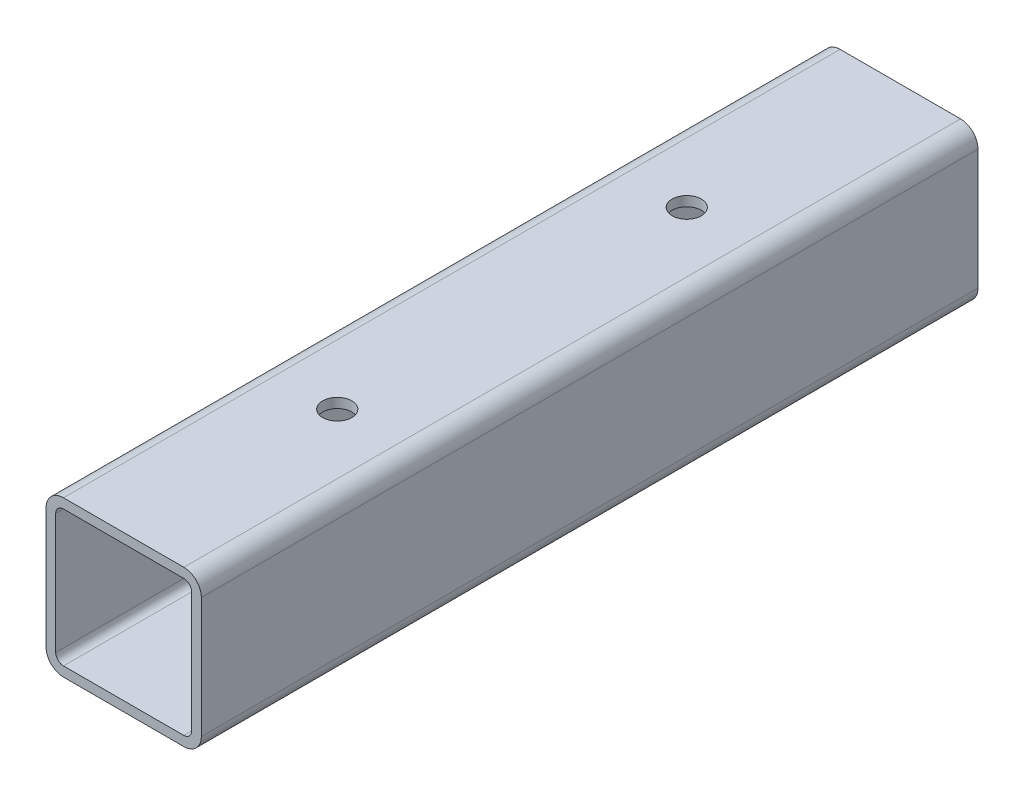
ISO-10303-21;
HEADER;
FILE_DESCRIPTION(('STEP AP214'),'2;1');
FILE_NAME('part.step','',(''),(''),'','','');
FILE_SCHEMA(('AUTOMOTIVE_DESIGN { 1 0 10303 214 1 1 1 1 }'));
ENDSEC;
DATA;
#1=APPLICATION_CONTEXT('core data for automotive mechanical design processes');
#2=APPLICATION_PROTOCOL_DEFINITION('international standard','automotive_design',2000,#1);
#3=PRODUCT_CONTEXT('',#1,'mechanical');
#4=PRODUCT('Part','Part','',(#3));
#5=PRODUCT_RELATED_PRODUCT_CATEGORY('part','',(#4));
#6=PRODUCT_DEFINITION_FORMATION('','',#4);
#7=PRODUCT_DEFINITION_CONTEXT('part definition',#1,'design');
#8=PRODUCT_DEFINITION('design','',#6,#7);
#9=PRODUCT_DEFINITION_SHAPE('','',#8);
#10=(LENGTH_UNIT() NAMED_UNIT(*) SI_UNIT(.MILLI.,.METRE.));
#11=(NAMED_UNIT(*) PLANE_ANGLE_UNIT() SI_UNIT($,.RADIAN.));
#12=(NAMED_UNIT(*) SI_UNIT($,.STERADIAN.) SOLID_ANGLE_UNIT());
#13=UNCERTAINTY_MEASURE_WITH_UNIT(LENGTH_MEASURE(1.E-05),#10,'distance_accuracy_value','');
#14=(GEOMETRIC_REPRESENTATION_CONTEXT(3) GLOBAL_UNCERTAINTY_ASSIGNED_CONTEXT((#13)) GLOBAL_UNIT_ASSIGNED_CONTEXT((#10,
#11,#12)) REPRESENTATION_CONTEXT('',''));
#15=CARTESIAN_POINT('',(0.,0.,0.));
#16=DIRECTION('',(0.,0.,1.));
#17=DIRECTION('',(1.,0.,0.));
#18=AXIS2_PLACEMENT_3D('',#15,#16,#17);
#19=CARTESIAN_POINT('',(-19.685,19.685,127.));
#20=DIRECTION('',(0.,0.,-1.));
#21=DIRECTION('',(-1.,0.,0.));
#22=AXIS2_PLACEMENT_3D('',#19,#20,#21);
#23=PLANE('',#22);
#24=CARTESIAN_POINT('',(-19.685,19.685,127.));
#25=DIRECTION('',(0.,0.,1.));
#26=DIRECTION('',(-1.,0.,0.));
#27=AXIS2_PLACEMENT_3D('',#24,#25,#26);
#28=CIRCLE('',#27,5.715);
#29=CARTESIAN_POINT('',(-19.685,25.4,127.));
#30=VERTEX_POINT('',#29);
#31=CARTESIAN_POINT('',(-25.4,19.685,127.));
#32=VERTEX_POINT('',#31);
#33=EDGE_CURVE('E216',#30,#32,#28,.T.);
#34=ORIENTED_EDGE('',*,*,#33,.T.);
#35=DIRECTION('',(0.,-1.,0.));
#36=VECTOR('',#35,1.);
#37=CARTESIAN_POINT('',(-25.4,-19.685,127.));
#38=LINE('',#37,#36);
#39=CARTESIAN_POINT('',(-25.4,-19.685,127.));
#40=VERTEX_POINT('',#39);
#41=EDGE_CURVE('E219',#32,#40,#38,.T.);
#42=ORIENTED_EDGE('',*,*,#41,.T.);
#43=CARTESIAN_POINT('',(-19.685,-19.685,127.));
#44=DIRECTION('',(0.,0.,1.));
#45=DIRECTION('',(-1.,0.,0.));
#46=AXIS2_PLACEMENT_3D('',#43,#44,#45);
#47=CIRCLE('',#46,5.715);
#48=CARTESIAN_POINT('',(-19.685,-25.4,127.));
#49=VERTEX_POINT('',#48);
#50=EDGE_CURVE('E222',#40,#49,#47,.T.);
#51=ORIENTED_EDGE('',*,*,#50,.T.);
#52=DIRECTION('',(1.,0.,0.));
#53=VECTOR('',#52,1.);
#54=CARTESIAN_POINT('',(-19.685,-25.4,127.));
#55=LINE('',#54,#53);
#56=CARTESIAN_POINT('',(19.685,-25.4,127.));
#57=VERTEX_POINT('',#56);
#58=EDGE_CURVE('E224',#49,#57,#55,.T.);
#59=ORIENTED_EDGE('',*,*,#58,.T.);
#60=CARTESIAN_POINT('',(19.685,-19.685,127.));
#61=DIRECTION('',(0.,0.,1.));
#62=DIRECTION('',(1.,0.,0.));
#63=AXIS2_PLACEMENT_3D('',#60,#61,#62);
#64=CIRCLE('',#63,5.715);
#65=CARTESIAN_POINT('',(25.4,-19.685,127.));
#66=VERTEX_POINT('',#65);
#67=EDGE_CURVE('E226',#57,#66,#64,.T.);
#68=ORIENTED_EDGE('',*,*,#67,.T.);
#69=DIRECTION('',(0.,1.,0.));
#70=VECTOR('',#69,1.);
#71=CARTESIAN_POINT('',(25.4,-19.685,127.));
#72=LINE('',#71,#70);
#73=CARTESIAN_POINT('',(25.4,19.685,127.));
#74=VERTEX_POINT('',#73);
#75=EDGE_CURVE('E228',#66,#74,#72,.T.);
#76=ORIENTED_EDGE('',*,*,#75,.T.);
#77=CARTESIAN_POINT('',(19.685,19.685,127.));
#78=DIRECTION('',(0.,0.,1.));
#79=DIRECTION('',(-1.,0.,0.));
#80=AXIS2_PLACEMENT_3D('',#77,#78,#79);
#81=CIRCLE('',#80,5.715);
#82=CARTESIAN_POINT('',(19.685,25.4,127.));
#83=VERTEX_POINT('',#82);
#84=EDGE_CURVE('E230',#74,#83,#81,.T.);
#85=ORIENTED_EDGE('',*,*,#84,.T.);
#86=DIRECTION('',(-1.,0.,0.));
#87=VECTOR('',#86,1.);
#88=CARTESIAN_POINT('',(-19.685,25.4,127.));
#89=LINE('',#88,#87);
#90=EDGE_CURVE('E232',#83,#30,#89,.T.);
#91=ORIENTED_EDGE('',*,*,#90,.T.);
#92=EDGE_LOOP('',(#34,#42,#51,#59,#68,#76,#85,#91));
#93=FACE_BOUND('',#92,.T.);
#94=CARTESIAN_POINT('',(-19.685,-19.685,127.));
#95=DIRECTION('',(0.,0.,1.));
#96=DIRECTION('',(-1.,0.,0.));
#97=AXIS2_PLACEMENT_3D('',#94,#95,#96);
#98=CIRCLE('',#97,2.54);
#99=CARTESIAN_POINT('',(-22.2249999999999,-19.685,127.));
#100=VERTEX_POINT('',#99);
#101=CARTESIAN_POINT('',(-19.685,-22.225,127.));
#102=VERTEX_POINT('',#101);
#103=EDGE_CURVE('E149',#100,#102,#98,.T.);
#104=ORIENTED_EDGE('',*,*,#103,.F.);
#105=DIRECTION('',(0.,-1.,0.));
#106=VECTOR('',#105,1.);
#107=CARTESIAN_POINT('',(-22.2249999999999,-19.685,127.));
#108=LINE('',#107,#106);
#109=CARTESIAN_POINT('',(-22.2249999999999,19.685,127.));
#110=VERTEX_POINT('',#109);
#111=EDGE_CURVE('E183',#110,#100,#108,.T.);
#112=ORIENTED_EDGE('',*,*,#111,.F.);
#113=CARTESIAN_POINT('',(-19.685,19.685,127.));
#114=DIRECTION('',(0.,0.,1.));
#115=DIRECTION('',(-1.,0.,0.));
#116=AXIS2_PLACEMENT_3D('',#113,#114,#115);
#117=CIRCLE('',#116,2.54);
#118=CARTESIAN_POINT('',(-19.685,22.225,127.));
#119=VERTEX_POINT('',#118);
#120=EDGE_CURVE('E181',#119,#110,#117,.T.);
#121=ORIENTED_EDGE('',*,*,#120,.F.);
#122=DIRECTION('',(-1.,0.,0.));
#123=VECTOR('',#122,1.);
#124=CARTESIAN_POINT('',(-19.685,22.225,127.));
#125=LINE('',#124,#123);
#126=CARTESIAN_POINT('',(19.685,22.225,127.));
#127=VERTEX_POINT('',#126);
#128=EDGE_CURVE('E179',#127,#119,#125,.T.);
#129=ORIENTED_EDGE('',*,*,#128,.F.);
#130=CARTESIAN_POINT('',(19.685,19.685,127.));
#131=DIRECTION('',(0.,0.,1.));
#132=DIRECTION('',(-1.,0.,0.));
#133=AXIS2_PLACEMENT_3D('',#130,#131,#132);
#134=CIRCLE('',#133,2.54);
#135=CARTESIAN_POINT('',(22.2249999999999,19.685,127.));
#136=VERTEX_POINT('',#135);
#137=EDGE_CURVE('E177',#136,#127,#134,.T.);
#138=ORIENTED_EDGE('',*,*,#137,.F.);
#139=DIRECTION('',(0.,1.,0.));
#140=VECTOR('',#139,1.);
#141=CARTESIAN_POINT('',(22.2249999999999,-19.685,127.));
#142=LINE('',#141,#140);
#143=CARTESIAN_POINT('',(22.2249999999999,-19.685,127.));
#144=VERTEX_POINT('',#143);
#145=EDGE_CURVE('E172',#144,#136,#142,.T.);
#146=ORIENTED_EDGE('',*,*,#145,.F.);
#147=CARTESIAN_POINT('',(19.685,-19.685,127.));
#148=DIRECTION('',(0.,0.,1.));
#149=DIRECTION('',(1.,0.,0.));
#150=AXIS2_PLACEMENT_3D('',#147,#148,#149);
#151=CIRCLE('',#150,2.54);
#152=CARTESIAN_POINT('',(19.685,-22.225,127.));
#153=VERTEX_POINT('',#152);
#154=EDGE_CURVE('E170',#153,#144,#151,.T.);
#155=ORIENTED_EDGE('',*,*,#154,.F.);
#156=DIRECTION('',(1.,0.,0.));
#157=VECTOR('',#156,1.);
#158=CARTESIAN_POINT('',(-19.685,-22.225,127.));
#159=LINE('',#158,#157);
#160=EDGE_CURVE('E157',#102,#153,#159,.T.);
#161=ORIENTED_EDGE('',*,*,#160,.F.);
#162=EDGE_LOOP('',(#104,#112,#121,#129,#138,#146,#155,#161));
#163=FACE_BOUND('',#162,.T.);
#164=ADVANCED_FACE('F34',(#93,#163),#23,.F.);
#165=CARTESIAN_POINT('',(-19.685,19.685,-127.));
#166=DIRECTION('',(0.,0.,-1.));
#167=DIRECTION('',(-1.,0.,0.));
#168=AXIS2_PLACEMENT_3D('',#165,#166,#167);
#169=PLANE('',#168);
#170=CARTESIAN_POINT('',(-19.685,19.685,-127.));
#171=DIRECTION('',(0.,0.,1.));
#172=DIRECTION('',(-1.,0.,0.));
#173=AXIS2_PLACEMENT_3D('',#170,#171,#172);
#174=CIRCLE('',#173,5.715);
#175=CARTESIAN_POINT('',(-19.685,25.4,-127.));
#176=VERTEX_POINT('',#175);
#177=CARTESIAN_POINT('',(-25.4,19.685,-127.));
#178=VERTEX_POINT('',#177);
#179=EDGE_CURVE('E165',#176,#178,#174,.T.);
#180=ORIENTED_EDGE('',*,*,#179,.F.);
#181=DIRECTION('',(-1.,0.,0.));
#182=VECTOR('',#181,1.);
#183=CARTESIAN_POINT('',(-19.685,25.4,-127.));
#184=LINE('',#183,#182);
#185=CARTESIAN_POINT('',(19.685,25.4,-127.));
#186=VERTEX_POINT('',#185);
#187=EDGE_CURVE('E220',#186,#176,#184,.T.);
#188=ORIENTED_EDGE('',*,*,#187,.F.);
#189=CARTESIAN_POINT('',(19.685,19.685,-127.));
#190=DIRECTION('',(0.,0.,1.));
#191=DIRECTION('',(-1.,0.,0.));
#192=AXIS2_PLACEMENT_3D('',#189,#190,#191);
#193=CIRCLE('',#192,5.715);
#194=CARTESIAN_POINT('',(25.4,19.685,-127.));
#195=VERTEX_POINT('',#194);
#196=EDGE_CURVE('E247',#195,#186,#193,.T.);
#197=ORIENTED_EDGE('',*,*,#196,.F.);
#198=DIRECTION('',(0.,1.,0.));
#199=VECTOR('',#198,1.);
#200=CARTESIAN_POINT('',(25.4,-19.685,-127.));
#201=LINE('',#200,#199);
#202=CARTESIAN_POINT('',(25.4,-19.685,-127.));
#203=VERTEX_POINT('',#202);
#204=EDGE_CURVE('E245',#203,#195,#201,.T.);
#205=ORIENTED_EDGE('',*,*,#204,.F.);
#206=CARTESIAN_POINT('',(19.685,-19.685,-127.));
#207=DIRECTION('',(0.,0.,1.));
#208=DIRECTION('',(1.,0.,0.));
#209=AXIS2_PLACEMENT_3D('',#206,#207,#208);
#210=CIRCLE('',#209,5.715);
#211=CARTESIAN_POINT('',(19.685,-25.4,-127.));
#212=VERTEX_POINT('',#211);
#213=EDGE_CURVE('E243',#212,#203,#210,.T.);
#214=ORIENTED_EDGE('',*,*,#213,.F.);
#215=DIRECTION('',(1.,0.,0.));
#216=VECTOR('',#215,1.);
#217=CARTESIAN_POINT('',(-19.685,-25.4,-127.));
#218=LINE('',#217,#216);
#219=CARTESIAN_POINT('',(-19.685,-25.4,-127.));
#220=VERTEX_POINT('',#219);
#221=EDGE_CURVE('E241',#220,#212,#218,.T.);
#222=ORIENTED_EDGE('',*,*,#221,.F.);
#223=CARTESIAN_POINT('',(-19.685,-19.685,-127.));
#224=DIRECTION('',(0.,0.,1.));
#225=DIRECTION('',(-1.,0.,0.));
#226=AXIS2_PLACEMENT_3D('',#223,#224,#225);
#227=CIRCLE('',#226,5.715);
#228=CARTESIAN_POINT('',(-25.4,-19.685,-127.));
#229=VERTEX_POINT('',#228);
#230=EDGE_CURVE('E239',#229,#220,#227,.T.);
#231=ORIENTED_EDGE('',*,*,#230,.F.);
#232=DIRECTION('',(0.,-1.,0.));
#233=VECTOR('',#232,1.);
#234=CARTESIAN_POINT('',(-25.4,-19.685,-127.));
#235=LINE('',#234,#233);
#236=EDGE_CURVE('E237',#178,#229,#235,.T.);
#237=ORIENTED_EDGE('',*,*,#236,.F.);
#238=EDGE_LOOP('',(#180,#188,#197,#205,#214,#222,#231,#237));
#239=FACE_BOUND('',#238,.T.);
#240=DIRECTION('',(0.,-1.,0.));
#241=VECTOR('',#240,1.);
#242=CARTESIAN_POINT('',(-22.2249999999999,-19.685,-127.));
#243=LINE('',#242,#241);
#244=CARTESIAN_POINT('',(-22.2249999999999,19.685,-127.));
#245=VERTEX_POINT('',#244);
#246=CARTESIAN_POINT('',(-22.2249999999999,-19.685,-127.));
#247=VERTEX_POINT('',#246);
#248=EDGE_CURVE('E158',#245,#247,#243,.T.);
#249=ORIENTED_EDGE('',*,*,#248,.T.);
#250=CARTESIAN_POINT('',(-19.685,-19.685,-127.));
#251=DIRECTION('',(0.,0.,1.));
#252=DIRECTION('',(-1.,0.,0.));
#253=AXIS2_PLACEMENT_3D('',#250,#251,#252);
#254=CIRCLE('',#253,2.54);
#255=CARTESIAN_POINT('',(-19.685,-22.225,-127.));
#256=VERTEX_POINT('',#255);
#257=EDGE_CURVE('E59',#247,#256,#254,.T.);
#258=ORIENTED_EDGE('',*,*,#257,.T.);
#259=DIRECTION('',(1.,0.,0.));
#260=VECTOR('',#259,1.);
#261=CARTESIAN_POINT('',(-19.685,-22.225,-127.));
#262=LINE('',#261,#260);
#263=CARTESIAN_POINT('',(19.685,-22.225,-127.));
#264=VERTEX_POINT('',#263);
#265=EDGE_CURVE('E164',#256,#264,#262,.T.);
#266=ORIENTED_EDGE('',*,*,#265,.T.);
#267=CARTESIAN_POINT('',(19.685,-19.685,-127.));
#268=DIRECTION('',(0.,0.,1.));
#269=DIRECTION('',(1.,0.,0.));
#270=AXIS2_PLACEMENT_3D('',#267,#268,#269);
#271=CIRCLE('',#270,2.54);
#272=CARTESIAN_POINT('',(22.2249999999999,-19.685,-127.));
#273=VERTEX_POINT('',#272);
#274=EDGE_CURVE('E188',#264,#273,#271,.T.);
#275=ORIENTED_EDGE('',*,*,#274,.T.);
#276=DIRECTION('',(0.,1.,0.));
#277=VECTOR('',#276,1.);
#278=CARTESIAN_POINT('',(22.2249999999999,-19.685,-127.));
#279=LINE('',#278,#277);
#280=CARTESIAN_POINT('',(22.2249999999999,19.685,-127.));
#281=VERTEX_POINT('',#280);
#282=EDGE_CURVE('E191',#273,#281,#279,.T.);
#283=ORIENTED_EDGE('',*,*,#282,.T.);
#284=CARTESIAN_POINT('',(19.685,19.685,-127.));
#285=DIRECTION('',(0.,0.,1.));
#286=DIRECTION('',(-1.,0.,0.));
#287=AXIS2_PLACEMENT_3D('',#284,#285,#286);
#288=CIRCLE('',#287,2.54);
#289=CARTESIAN_POINT('',(19.685,22.225,-127.));
#290=VERTEX_POINT('',#289);
#291=EDGE_CURVE('E194',#281,#290,#288,.T.);
#292=ORIENTED_EDGE('',*,*,#291,.T.);
#293=DIRECTION('',(-1.,0.,0.));
#294=VECTOR('',#293,1.);
#295=CARTESIAN_POINT('',(-19.685,22.225,-127.));
#296=LINE('',#295,#294);
#297=CARTESIAN_POINT('',(-19.685,22.225,-127.));
#298=VERTEX_POINT('',#297);
#299=EDGE_CURVE('E197',#290,#298,#296,.T.);
#300=ORIENTED_EDGE('',*,*,#299,.T.);
#301=CARTESIAN_POINT('',(-19.685,19.685,-127.));
#302=DIRECTION('',(0.,0.,1.));
#303=DIRECTION('',(-1.,0.,0.));
#304=AXIS2_PLACEMENT_3D('',#301,#302,#303);
#305=CIRCLE('',#304,2.54);
#306=EDGE_CURVE('E200',#298,#245,#305,.T.);
#307=ORIENTED_EDGE('',*,*,#306,.T.);
#308=EDGE_LOOP('',(#249,#258,#266,#275,#283,#292,#300,#307));
#309=FACE_BOUND('',#308,.T.);
#310=ADVANCED_FACE('F309',(#239,#309),#169,.T.);
#311=CARTESIAN_POINT('',(-19.685,19.685,127.));
#312=DIRECTION('',(0.,0.,-1.));
#313=DIRECTION('',(-1.,0.,0.));
#314=AXIS2_PLACEMENT_3D('',#311,#312,#313);
#315=CYLINDRICAL_SURFACE('',#314,5.715);
#316=ORIENTED_EDGE('',*,*,#179,.T.);
#317=DIRECTION('',(0.,0.,-1.));
#318=VECTOR('',#317,1.);
#319=CARTESIAN_POINT('',(-25.4,19.685,127.));
#320=LINE('',#319,#318);
#321=EDGE_CURVE('E11',#32,#178,#320,.T.);
#322=ORIENTED_EDGE('',*,*,#321,.F.);
#323=ORIENTED_EDGE('',*,*,#33,.F.);
#324=DIRECTION('',(0.,0.,-1.));
#325=VECTOR('',#324,1.);
#326=CARTESIAN_POINT('',(-19.685,25.4,127.));
#327=LINE('',#326,#325);
#328=EDGE_CURVE('E234',#30,#176,#327,.T.);
#329=ORIENTED_EDGE('',*,*,#328,.T.);
#330=EDGE_LOOP('',(#316,#322,#323,#329));
#331=FACE_BOUND('',#330,.T.);
#332=ADVANCED_FACE('F36',(#331),#315,.T.);
#333=CARTESIAN_POINT('',(-25.4,-19.685,127.));
#334=DIRECTION('',(1.,0.,0.));
#335=DIRECTION('',(0.,1.,0.));
#336=AXIS2_PLACEMENT_3D('',#333,#334,#335);
#337=PLANE('',#336);
#338=ORIENTED_EDGE('',*,*,#236,.T.);
#339=DIRECTION('',(0.,0.,-1.));
#340=VECTOR('',#339,1.);
#341=CARTESIAN_POINT('',(-25.4,-19.685,127.));
#342=LINE('',#341,#340);
#343=EDGE_CURVE('E43',#40,#229,#342,.T.);
#344=ORIENTED_EDGE('',*,*,#343,.F.);
#345=ORIENTED_EDGE('',*,*,#41,.F.);
#346=ORIENTED_EDGE('',*,*,#321,.T.);
#347=EDGE_LOOP('',(#338,#344,#345,#346));
#348=FACE_BOUND('',#347,.T.);
#349=ADVANCED_FACE('F340',(#348),#337,.F.);
#350=CARTESIAN_POINT('',(-19.685,-19.685,127.));
#351=DIRECTION('',(0.,0.,-1.));
#352=DIRECTION('',(-1.,0.,0.));
#353=AXIS2_PLACEMENT_3D('',#350,#351,#352);
#354=CYLINDRICAL_SURFACE('',#353,5.715);
#355=ORIENTED_EDGE('',*,*,#230,.T.);
#356=DIRECTION('',(0.,0.,-1.));
#357=VECTOR('',#356,1.);
#358=CARTESIAN_POINT('',(-19.685,-25.4,127.));
#359=LINE('',#358,#357);
#360=EDGE_CURVE('E264',#49,#220,#359,.T.);
#361=ORIENTED_EDGE('',*,*,#360,.F.);
#362=ORIENTED_EDGE('',*,*,#50,.F.);
#363=ORIENTED_EDGE('',*,*,#343,.T.);
#364=EDGE_LOOP('',(#355,#361,#362,#363));
#365=FACE_BOUND('',#364,.T.);
#366=ADVANCED_FACE('F338',(#365),#354,.T.);
#367=CARTESIAN_POINT('',(-19.685,-25.4,127.));
#368=DIRECTION('',(0.,1.,0.));
#369=DIRECTION('',(-1.,0.,0.));
#370=AXIS2_PLACEMENT_3D('',#367,#368,#369);
#371=PLANE('',#370);
#372=CARTESIAN_POINT('',(0.,-25.4,-57.15));
#373=DIRECTION('',(0.,1.,0.));
#374=DIRECTION('',(-1.,0.,0.));
#375=AXIS2_PLACEMENT_3D('',#372,#373,#374);
#376=CIRCLE('',#375,4.7625);
#377=CARTESIAN_POINT('',(0.,-25.4,-52.3875));
#378=VERTEX_POINT('',#377);
#379=EDGE_CURVE('E186',#378,#378,#376,.T.);
#380=ORIENTED_EDGE('',*,*,#379,.T.);
#381=EDGE_LOOP('',(#380));
#382=FACE_BOUND('',#381,.T.);
#383=CARTESIAN_POINT('',(0.,-25.4,57.15));
#384=DIRECTION('',(0.,1.,0.));
#385=DIRECTION('',(-1.,0.,0.));
#386=AXIS2_PLACEMENT_3D('',#383,#384,#385);
#387=CIRCLE('',#386,4.7625);
#388=CARTESIAN_POINT('',(0.,-25.4,61.9125));
#389=VERTEX_POINT('',#388);
#390=EDGE_CURVE('E279',#389,#389,#387,.T.);
#391=ORIENTED_EDGE('',*,*,#390,.T.);
#392=EDGE_LOOP('',(#391));
#393=FACE_BOUND('',#392,.T.);
#394=ORIENTED_EDGE('',*,*,#221,.T.);
#395=DIRECTION('',(0.,0.,-1.));
#396=VECTOR('',#395,1.);
#397=CARTESIAN_POINT('',(19.685,-25.4,127.));
#398=LINE('',#397,#396);
#399=EDGE_CURVE('E261',#57,#212,#398,.T.);
#400=ORIENTED_EDGE('',*,*,#399,.F.);
#401=ORIENTED_EDGE('',*,*,#58,.F.);
#402=ORIENTED_EDGE('',*,*,#360,.T.);
#403=EDGE_LOOP('',(#394,#400,#401,#402));
#404=FACE_BOUND('',#403,.T.);
#405=ADVANCED_FACE('F292',(#382,#393,#404),#371,.F.);
#406=CARTESIAN_POINT('',(19.685,-19.685,127.));
#407=DIRECTION('',(0.,0.,-1.));
#408=DIRECTION('',(-1.,0.,0.));
#409=AXIS2_PLACEMENT_3D('',#406,#407,#408);
#410=CYLINDRICAL_SURFACE('',#409,5.715);
#411=ORIENTED_EDGE('',*,*,#213,.T.);
#412=DIRECTION('',(0.,0.,-1.));
#413=VECTOR('',#412,1.);
#414=CARTESIAN_POINT('',(25.4,-19.685,127.));
#415=LINE('',#414,#413);
#416=EDGE_CURVE('E258',#66,#203,#415,.T.);
#417=ORIENTED_EDGE('',*,*,#416,.F.);
#418=ORIENTED_EDGE('',*,*,#67,.F.);
#419=ORIENTED_EDGE('',*,*,#399,.T.);
#420=EDGE_LOOP('',(#411,#417,#418,#419));
#421=FACE_BOUND('',#420,.T.);
#422=ADVANCED_FACE('F331',(#421),#410,.T.);
#423=CARTESIAN_POINT('',(25.4,-19.685,127.));
#424=DIRECTION('',(-1.,0.,0.));
#425=DIRECTION('',(0.,-1.,0.));
#426=AXIS2_PLACEMENT_3D('',#423,#424,#425);
#427=PLANE('',#426);
#428=ORIENTED_EDGE('',*,*,#204,.T.);
#429=DIRECTION('',(0.,0.,-1.));
#430=VECTOR('',#429,1.);
#431=CARTESIAN_POINT('',(25.4,19.685,127.));
#432=LINE('',#431,#430);
#433=EDGE_CURVE('E255',#74,#195,#432,.T.);
#434=ORIENTED_EDGE('',*,*,#433,.F.);
#435=ORIENTED_EDGE('',*,*,#75,.F.);
#436=ORIENTED_EDGE('',*,*,#416,.T.);
#437=EDGE_LOOP('',(#428,#434,#435,#436));
#438=FACE_BOUND('',#437,.T.);
#439=ADVANCED_FACE('F327',(#438),#427,.F.);
#440=CARTESIAN_POINT('',(19.685,19.685,127.));
#441=DIRECTION('',(0.,0.,-1.));
#442=DIRECTION('',(-1.,0.,0.));
#443=AXIS2_PLACEMENT_3D('',#440,#441,#442);
#444=CYLINDRICAL_SURFACE('',#443,5.715);
#445=ORIENTED_EDGE('',*,*,#196,.T.);
#446=DIRECTION('',(0.,0.,-1.));
#447=VECTOR('',#446,1.);
#448=CARTESIAN_POINT('',(19.685,25.4,127.));
#449=LINE('',#448,#447);
#450=EDGE_CURVE('E252',#83,#186,#449,.T.);
#451=ORIENTED_EDGE('',*,*,#450,.F.);
#452=ORIENTED_EDGE('',*,*,#84,.F.);
#453=ORIENTED_EDGE('',*,*,#433,.T.);
#454=EDGE_LOOP('',(#445,#451,#452,#453));
#455=FACE_BOUND('',#454,.T.);
#456=ADVANCED_FACE('F323',(#455),#444,.T.);
#457=CARTESIAN_POINT('',(-19.685,25.4,127.));
#458=DIRECTION('',(0.,-1.,0.));
#459=DIRECTION('',(0.,0.,-1.));
#460=AXIS2_PLACEMENT_3D('',#457,#458,#459);
#461=PLANE('',#460);
#462=CARTESIAN_POINT('',(0.,25.4,-57.15));
#463=DIRECTION('',(0.,-1.,0.));
#464=DIRECTION('',(0.,0.,-1.));
#465=AXIS2_PLACEMENT_3D('',#462,#463,#464);
#466=CIRCLE('',#465,4.7625);
#467=CARTESIAN_POINT('',(0.,25.4,-52.3875));
#468=VERTEX_POINT('',#467);
#469=EDGE_CURVE('E287',#468,#468,#466,.T.);
#470=ORIENTED_EDGE('',*,*,#469,.T.);
#471=EDGE_LOOP('',(#470));
#472=FACE_BOUND('',#471,.T.);
#473=CARTESIAN_POINT('',(0.,25.4,57.15));
#474=DIRECTION('',(0.,-1.,0.));
#475=DIRECTION('',(0.,0.,-1.));
#476=AXIS2_PLACEMENT_3D('',#473,#474,#475);
#477=CIRCLE('',#476,4.7625);
#478=CARTESIAN_POINT('',(0.,25.4,61.9125));
#479=VERTEX_POINT('',#478);
#480=EDGE_CURVE('E274',#479,#479,#477,.T.);
#481=ORIENTED_EDGE('',*,*,#480,.T.);
#482=EDGE_LOOP('',(#481));
#483=FACE_BOUND('',#482,.T.);
#484=ORIENTED_EDGE('',*,*,#187,.T.);
#485=ORIENTED_EDGE('',*,*,#328,.F.);
#486=ORIENTED_EDGE('',*,*,#90,.F.);
#487=ORIENTED_EDGE('',*,*,#450,.T.);
#488=EDGE_LOOP('',(#484,#485,#486,#487));
#489=FACE_BOUND('',#488,.T.);
#490=ADVANCED_FACE('F320',(#472,#483,#489),#461,.F.);
#491=CARTESIAN_POINT('',(-19.685,-19.685,127.));
#492=DIRECTION('',(0.,0.,-1.));
#493=DIRECTION('',(-1.,0.,0.));
#494=AXIS2_PLACEMENT_3D('',#491,#492,#493);
#495=CYLINDRICAL_SURFACE('',#494,2.54);
#496=ORIENTED_EDGE('',*,*,#257,.F.);
#497=DIRECTION('',(0.,0.,-1.));
#498=VECTOR('',#497,1.);
#499=CARTESIAN_POINT('',(-22.2249999999999,-19.685,127.));
#500=LINE('',#499,#498);
#501=EDGE_CURVE('E153',#100,#247,#500,.T.);
#502=ORIENTED_EDGE('',*,*,#501,.F.);
#503=ORIENTED_EDGE('',*,*,#103,.T.);
#504=DIRECTION('',(0.,0.,-1.));
#505=VECTOR('',#504,1.);
#506=CARTESIAN_POINT('',(-19.685,-22.225,127.));
#507=LINE('',#506,#505);
#508=EDGE_CURVE('E152',#102,#256,#507,.T.);
#509=ORIENTED_EDGE('',*,*,#508,.T.);
#510=EDGE_LOOP('',(#496,#502,#503,#509));
#511=FACE_BOUND('',#510,.T.);
#512=ADVANCED_FACE('F151',(#511),#495,.F.);
#513=CARTESIAN_POINT('',(-19.685,-22.225,127.));
#514=DIRECTION('',(0.,1.,0.));
#515=DIRECTION('',(0.,0.,1.));
#516=AXIS2_PLACEMENT_3D('',#513,#514,#515);
#517=PLANE('',#516);
#518=CARTESIAN_POINT('',(0.,-22.225,-57.15));
#519=DIRECTION('',(0.,1.,0.));
#520=DIRECTION('',(0.,0.,1.));
#521=AXIS2_PLACEMENT_3D('',#518,#519,#520);
#522=CIRCLE('',#521,4.7625);
#523=CARTESIAN_POINT('',(0.,-22.225,-52.3875));
#524=VERTEX_POINT('',#523);
#525=EDGE_CURVE('E284',#524,#524,#522,.T.);
#526=ORIENTED_EDGE('',*,*,#525,.F.);
#527=EDGE_LOOP('',(#526));
#528=FACE_BOUND('',#527,.T.);
#529=CARTESIAN_POINT('',(0.,-22.225,57.15));
#530=DIRECTION('',(0.,1.,0.));
#531=DIRECTION('',(0.,0.,1.));
#532=AXIS2_PLACEMENT_3D('',#529,#530,#531);
#533=CIRCLE('',#532,4.7625);
#534=CARTESIAN_POINT('',(0.,-22.225,61.9125));
#535=VERTEX_POINT('',#534);
#536=EDGE_CURVE('E270',#535,#535,#533,.T.);
#537=ORIENTED_EDGE('',*,*,#536,.F.);
#538=EDGE_LOOP('',(#537));
#539=FACE_BOUND('',#538,.T.);
#540=ORIENTED_EDGE('',*,*,#265,.F.);
#541=ORIENTED_EDGE('',*,*,#508,.F.);
#542=ORIENTED_EDGE('',*,*,#160,.T.);
#543=DIRECTION('',(0.,0.,-1.));
#544=VECTOR('',#543,1.);
#545=CARTESIAN_POINT('',(19.685,-22.225,127.));
#546=LINE('',#545,#544);
#547=EDGE_CURVE('E166',#153,#264,#546,.T.);
#548=ORIENTED_EDGE('',*,*,#547,.T.);
#549=EDGE_LOOP('',(#540,#541,#542,#548));
#550=FACE_BOUND('',#549,.T.);
#551=ADVANCED_FACE('F161',(#528,#539,#550),#517,.T.);
#552=CARTESIAN_POINT('',(19.685,-19.685,127.));
#553=DIRECTION('',(0.,0.,-1.));
#554=DIRECTION('',(-1.,0.,0.));
#555=AXIS2_PLACEMENT_3D('',#552,#553,#554);
#556=CYLINDRICAL_SURFACE('',#555,2.54);
#557=ORIENTED_EDGE('',*,*,#274,.F.);
#558=ORIENTED_EDGE('',*,*,#547,.F.);
#559=ORIENTED_EDGE('',*,*,#154,.T.);
#560=DIRECTION('',(0.,0.,-1.));
#561=VECTOR('',#560,1.);
#562=CARTESIAN_POINT('',(22.2249999999999,-19.685,127.));
#563=LINE('',#562,#561);
#564=EDGE_CURVE('E213',#144,#273,#563,.T.);
#565=ORIENTED_EDGE('',*,*,#564,.T.);
#566=EDGE_LOOP('',(#557,#558,#559,#565));
#567=FACE_BOUND('',#566,.T.);
#568=ADVANCED_FACE('F395',(#567),#556,.F.);
#569=CARTESIAN_POINT('',(22.2249999999999,-19.685,127.));
#570=DIRECTION('',(-1.,0.,0.));
#571=DIRECTION('',(0.,0.,1.));
#572=AXIS2_PLACEMENT_3D('',#569,#570,#571);
#573=PLANE('',#572);
#574=ORIENTED_EDGE('',*,*,#282,.F.);
#575=ORIENTED_EDGE('',*,*,#564,.F.);
#576=ORIENTED_EDGE('',*,*,#145,.T.);
#577=DIRECTION('',(0.,0.,-1.));
#578=VECTOR('',#577,1.);
#579=CARTESIAN_POINT('',(22.2249999999999,19.685,127.));
#580=LINE('',#579,#578);
#581=EDGE_CURVE('E211',#136,#281,#580,.T.);
#582=ORIENTED_EDGE('',*,*,#581,.T.);
#583=EDGE_LOOP('',(#574,#575,#576,#582));
#584=FACE_BOUND('',#583,.T.);
#585=ADVANCED_FACE('F392',(#584),#573,.T.);
#586=CARTESIAN_POINT('',(19.685,19.685,127.));
#587=DIRECTION('',(0.,0.,-1.));
#588=DIRECTION('',(-1.,0.,0.));
#589=AXIS2_PLACEMENT_3D('',#586,#587,#588);
#590=CYLINDRICAL_SURFACE('',#589,2.54);
#591=ORIENTED_EDGE('',*,*,#291,.F.);
#592=ORIENTED_EDGE('',*,*,#581,.F.);
#593=ORIENTED_EDGE('',*,*,#137,.T.);
#594=DIRECTION('',(0.,0.,-1.));
#595=VECTOR('',#594,1.);
#596=CARTESIAN_POINT('',(19.685,22.225,127.));
#597=LINE('',#596,#595);
#598=EDGE_CURVE('E209',#127,#290,#597,.T.);
#599=ORIENTED_EDGE('',*,*,#598,.T.);
#600=EDGE_LOOP('',(#591,#592,#593,#599));
#601=FACE_BOUND('',#600,.T.);
#602=ADVANCED_FACE('F387',(#601),#590,.F.);
#603=CARTESIAN_POINT('',(-19.685,22.225,127.));
#604=DIRECTION('',(0.,-1.,0.));
#605=DIRECTION('',(0.,0.,-1.));
#606=AXIS2_PLACEMENT_3D('',#603,#604,#605);
#607=PLANE('',#606);
#608=CARTESIAN_POINT('',(0.,22.225,-57.15));
#609=DIRECTION('',(0.,-1.,0.));
#610=DIRECTION('',(0.,0.,-1.));
#611=AXIS2_PLACEMENT_3D('',#608,#609,#610);
#612=CIRCLE('',#611,4.7625);
#613=CARTESIAN_POINT('',(0.,22.225,-52.3875));
#614=VERTEX_POINT('',#613);
#615=EDGE_CURVE('E38',#614,#614,#612,.T.);
#616=ORIENTED_EDGE('',*,*,#615,.F.);
#617=EDGE_LOOP('',(#616));
#618=FACE_BOUND('',#617,.T.);
#619=CARTESIAN_POINT('',(0.,22.225,57.15));
#620=DIRECTION('',(0.,-1.,0.));
#621=DIRECTION('',(0.,0.,-1.));
#622=AXIS2_PLACEMENT_3D('',#619,#620,#621);
#623=CIRCLE('',#622,4.7625);
#624=CARTESIAN_POINT('',(0.,22.225,61.9125));
#625=VERTEX_POINT('',#624);
#626=EDGE_CURVE('E268',#625,#625,#623,.T.);
#627=ORIENTED_EDGE('',*,*,#626,.F.);
#628=EDGE_LOOP('',(#627));
#629=FACE_BOUND('',#628,.T.);
#630=ORIENTED_EDGE('',*,*,#299,.F.);
#631=ORIENTED_EDGE('',*,*,#598,.F.);
#632=ORIENTED_EDGE('',*,*,#128,.T.);
#633=DIRECTION('',(0.,0.,-1.));
#634=VECTOR('',#633,1.);
#635=CARTESIAN_POINT('',(-19.685,22.225,127.));
#636=LINE('',#635,#634);
#637=EDGE_CURVE('E207',#119,#298,#636,.T.);
#638=ORIENTED_EDGE('',*,*,#637,.T.);
#639=EDGE_LOOP('',(#630,#631,#632,#638));
#640=FACE_BOUND('',#639,.T.);
#641=ADVANCED_FACE('F383',(#618,#629,#640),#607,.T.);
#642=CARTESIAN_POINT('',(-19.685,19.685,127.));
#643=DIRECTION('',(0.,0.,-1.));
#644=DIRECTION('',(-1.,0.,0.));
#645=AXIS2_PLACEMENT_3D('',#642,#643,#644);
#646=CYLINDRICAL_SURFACE('',#645,2.54);
#647=ORIENTED_EDGE('',*,*,#306,.F.);
#648=ORIENTED_EDGE('',*,*,#637,.F.);
#649=ORIENTED_EDGE('',*,*,#120,.T.);
#650=DIRECTION('',(0.,0.,-1.));
#651=VECTOR('',#650,1.);
#652=CARTESIAN_POINT('',(-22.2249999999999,19.685,127.));
#653=LINE('',#652,#651);
#654=EDGE_CURVE('E51',#110,#245,#653,.T.);
#655=ORIENTED_EDGE('',*,*,#654,.T.);
#656=EDGE_LOOP('',(#647,#648,#649,#655));
#657=FACE_BOUND('',#656,.T.);
#658=ADVANCED_FACE('F380',(#657),#646,.F.);
#659=CARTESIAN_POINT('',(-22.2249999999999,-19.685,127.));
#660=DIRECTION('',(1.,0.,0.));
#661=DIRECTION('',(0.,0.,-1.));
#662=AXIS2_PLACEMENT_3D('',#659,#660,#661);
#663=PLANE('',#662);
#664=ORIENTED_EDGE('',*,*,#248,.F.);
#665=ORIENTED_EDGE('',*,*,#654,.F.);
#666=ORIENTED_EDGE('',*,*,#111,.T.);
#667=ORIENTED_EDGE('',*,*,#501,.T.);
#668=EDGE_LOOP('',(#664,#665,#666,#667));
#669=FACE_BOUND('',#668,.T.);
#670=ADVANCED_FACE('F374',(#669),#663,.T.);
#671=CARTESIAN_POINT('',(0.,-38.1,57.15));
#672=DIRECTION('',(0.,1.,0.));
#673=DIRECTION('',(0.,0.,1.));
#674=AXIS2_PLACEMENT_3D('',#671,#672,#673);
#675=CYLINDRICAL_SURFACE('',#674,4.7625);
#676=CARTESIAN_POINT('',(0.,22.225,61.9125));
#677=CARTESIAN_POINT('',(0.,22.2580729166667,61.9125));
#678=CARTESIAN_POINT('',(0.,22.2911458333333,61.9125));
#679=CARTESIAN_POINT('',(0.,22.3572916666667,61.9125));
#680=CARTESIAN_POINT('',(0.,22.3903645833333,61.9125));
#681=CARTESIAN_POINT('',(0.,22.4565104166667,61.9125));
#682=CARTESIAN_POINT('',(0.,22.4895833333333,61.9125));
#683=CARTESIAN_POINT('',(0.,22.5557291666667,61.9125));
#684=CARTESIAN_POINT('',(0.,22.5888020833333,61.9125));
#685=CARTESIAN_POINT('',(0.,22.6549479166667,61.9125));
#686=CARTESIAN_POINT('',(0.,22.6880208333333,61.9125));
#687=CARTESIAN_POINT('',(0.,22.7541666666667,61.9125));
#688=CARTESIAN_POINT('',(0.,22.7872395833333,61.9125));
#689=CARTESIAN_POINT('',(0.,22.8533854166667,61.9125));
#690=CARTESIAN_POINT('',(0.,22.8864583333333,61.9125));
#691=CARTESIAN_POINT('',(0.,22.9526041666666,61.9125));
#692=CARTESIAN_POINT('',(0.,22.9856770833333,61.9125));
#693=CARTESIAN_POINT('',(0.,23.0518229166666,61.9125));
#694=CARTESIAN_POINT('',(0.,23.0848958333333,61.9125));
#695=CARTESIAN_POINT('',(0.,23.1510416666666,61.9125));
#696=CARTESIAN_POINT('',(0.,23.1841145833333,61.9125));
#697=CARTESIAN_POINT('',(0.,23.2502604166666,61.9125));
#698=CARTESIAN_POINT('',(0.,23.2833333333333,61.9125));
#699=CARTESIAN_POINT('',(0.,23.3494791666666,61.9125));
#700=CARTESIAN_POINT('',(0.,23.3825520833333,61.9125));
#701=CARTESIAN_POINT('',(0.,23.4486979166666,61.9125));
#702=CARTESIAN_POINT('',(0.,23.4817708333333,61.9125));
#703=CARTESIAN_POINT('',(0.,23.5479166666666,61.9125));
#704=CARTESIAN_POINT('',(0.,23.5809895833333,61.9125));
#705=CARTESIAN_POINT('',(0.,23.6471354166667,61.9125));
#706=CARTESIAN_POINT('',(0.,23.6802083333333,61.9125));
#707=CARTESIAN_POINT('',(0.,23.7463541666666,61.9125));
#708=CARTESIAN_POINT('',(0.,23.7794270833333,61.9125));
#709=CARTESIAN_POINT('',(0.,23.8455729166666,61.9125));
#710=CARTESIAN_POINT('',(0.,23.8786458333333,61.9125));
#711=CARTESIAN_POINT('',(0.,23.9447916666666,61.9125));
#712=CARTESIAN_POINT('',(0.,23.9778645833333,61.9125));
#713=CARTESIAN_POINT('',(0.,24.0440104166666,61.9125));
#714=CARTESIAN_POINT('',(0.,24.0770833333333,61.9125));
#715=CARTESIAN_POINT('',(0.,24.1432291666666,61.9125));
#716=CARTESIAN_POINT('',(0.,24.1763020833333,61.9125));
#717=CARTESIAN_POINT('',(0.,24.2424479166666,61.9125));
#718=CARTESIAN_POINT('',(0.,24.2755208333333,61.9125));
#719=CARTESIAN_POINT('',(0.,24.3416666666666,61.9125));
#720=CARTESIAN_POINT('',(0.,24.3747395833333,61.9125));
#721=CARTESIAN_POINT('',(0.,24.4408854166666,61.9125));
#722=CARTESIAN_POINT('',(0.,24.4739583333333,61.9125));
#723=CARTESIAN_POINT('',(0.,24.5401041666666,61.9125));
#724=CARTESIAN_POINT('',(0.,24.5731770833333,61.9125));
#725=CARTESIAN_POINT('',(0.,24.6393229166666,61.9125));
#726=CARTESIAN_POINT('',(0.,24.6723958333333,61.9125));
#727=CARTESIAN_POINT('',(0.,24.7385416666666,61.9125));
#728=CARTESIAN_POINT('',(0.,24.7716145833333,61.9125));
#729=CARTESIAN_POINT('',(0.,24.8377604166666,61.9125));
#730=CARTESIAN_POINT('',(0.,24.8708333333333,61.9125));
#731=CARTESIAN_POINT('',(0.,24.9369791666666,61.9125));
#732=CARTESIAN_POINT('',(0.,24.9700520833333,61.9125));
#733=CARTESIAN_POINT('',(0.,25.0361979166666,61.9125));
#734=CARTESIAN_POINT('',(0.,25.0692708333333,61.9125));
#735=CARTESIAN_POINT('',(0.,25.1354166666666,61.9125));
#736=CARTESIAN_POINT('',(0.,25.1684895833333,61.9125));
#737=CARTESIAN_POINT('',(0.,25.2346354166666,61.9125));
#738=CARTESIAN_POINT('',(0.,25.2677083333333,61.9125));
#739=CARTESIAN_POINT('',(0.,25.3338541666666,61.9125));
#740=CARTESIAN_POINT('',(0.,25.3669270833333,61.9125));
#741=CARTESIAN_POINT('',(0.,25.4,61.9125));
#742=B_SPLINE_CURVE_WITH_KNOTS('',3,(#676,#677,#678,#679,#680,#681,#682,#683,#684,#685,#686,
#687,#688,#689,#690,#691,#692,#693,#694,#695,#696,#697,#698,#699,#700,#701,#702,#703,#704,#705,
#706,#707,#708,#709,#710,#711,#712,#713,#714,#715,#716,#717,#718,#719,#720,#721,#722,#723,#724,
#725,#726,#727,#728,#729,#730,#731,#732,#733,#734,#735,#736,#737,#738,#739,#740,#741),
.UNSPECIFIED.,.F.,.F.,(4,2,2,2,2,2,2,2,2,2,2,2,2,2,2,2,2,2,2,2,2,2,2,2,2,2,2,2,2,2,2,2,4),(0.,
0.0992187499999977,0.198437499999995,0.29765625,0.396874999999998,0.496093749999996,0.5953125,
0.694531249999998,0.793749999999996,0.892968749999994,0.992187499999991,1.09140625,
1.19062499999999,1.28984374999999,1.3890625,1.48828124999999,1.58749999999999,1.68671874999999,
1.78593749999999,1.88515624999999,1.98437499999999,2.08359374999999,2.18281249999999,
2.28203124999998,2.38124999999998,2.48046874999999,2.57968749999998,2.67890624999998,
2.77812499999999,2.87734374999998,2.97656249999998,3.07578124999997,3.17499999999998),.UNSPECIFIED.);
#743=EDGE_CURVE('BSEAM305',#625,#479,#742,.T.);
#744=ORIENTED_EDGE('',*,*,#626,.T.);
#745=ORIENTED_EDGE('',*,*,#480,.F.);
#746=ORIENTED_EDGE('',*,*,#743,.T.);
#747=ORIENTED_EDGE('',*,*,#743,.F.);
#748=EDGE_LOOP('',(#744,#746,#745,#747));
#749=FACE_BOUND('',#748,.T.);
#750=ADVANCED_FACE('F305',(#749),#675,.F.);
#751=CARTESIAN_POINT('',(0.,-38.1,-57.15));
#752=DIRECTION('',(0.,1.,0.));
#753=DIRECTION('',(0.,0.,1.));
#754=AXIS2_PLACEMENT_3D('',#751,#752,#753);
#755=CYLINDRICAL_SURFACE('',#754,4.7625);
#756=CARTESIAN_POINT('',(0.,22.225,-52.3875));
#757=CARTESIAN_POINT('',(0.,22.2580729166667,-52.3875));
#758=CARTESIAN_POINT('',(0.,22.2911458333333,-52.3875));
#759=CARTESIAN_POINT('',(0.,22.3572916666667,-52.3875));
#760=CARTESIAN_POINT('',(0.,22.3903645833333,-52.3875));
#761=CARTESIAN_POINT('',(0.,22.4565104166667,-52.3875));
#762=CARTESIAN_POINT('',(0.,22.4895833333333,-52.3875));
#763=CARTESIAN_POINT('',(0.,22.5557291666667,-52.3875));
#764=CARTESIAN_POINT('',(0.,22.5888020833333,-52.3875));
#765=CARTESIAN_POINT('',(0.,22.6549479166667,-52.3875));
#766=CARTESIAN_POINT('',(0.,22.6880208333333,-52.3875));
#767=CARTESIAN_POINT('',(0.,22.7541666666667,-52.3875));
#768=CARTESIAN_POINT('',(0.,22.7872395833333,-52.3875));
#769=CARTESIAN_POINT('',(0.,22.8533854166667,-52.3875));
#770=CARTESIAN_POINT('',(0.,22.8864583333333,-52.3875));
#771=CARTESIAN_POINT('',(0.,22.9526041666666,-52.3875));
#772=CARTESIAN_POINT('',(0.,22.9856770833333,-52.3875));
#773=CARTESIAN_POINT('',(0.,23.0518229166666,-52.3875));
#774=CARTESIAN_POINT('',(0.,23.0848958333333,-52.3875));
#775=CARTESIAN_POINT('',(0.,23.1510416666666,-52.3875));
#776=CARTESIAN_POINT('',(0.,23.1841145833333,-52.3875));
#777=CARTESIAN_POINT('',(0.,23.2502604166666,-52.3875));
#778=CARTESIAN_POINT('',(0.,23.2833333333333,-52.3875));
#779=CARTESIAN_POINT('',(0.,23.3494791666666,-52.3875));
#780=CARTESIAN_POINT('',(0.,23.3825520833333,-52.3875));
#781=CARTESIAN_POINT('',(0.,23.4486979166666,-52.3875));
#782=CARTESIAN_POINT('',(0.,23.4817708333333,-52.3875));
#783=CARTESIAN_POINT('',(0.,23.5479166666666,-52.3875));
#784=CARTESIAN_POINT('',(0.,23.5809895833333,-52.3875));
#785=CARTESIAN_POINT('',(0.,23.6471354166667,-52.3875));
#786=CARTESIAN_POINT('',(0.,23.6802083333333,-52.3875));
#787=CARTESIAN_POINT('',(0.,23.7463541666666,-52.3875));
#788=CARTESIAN_POINT('',(0.,23.7794270833333,-52.3875));
#789=CARTESIAN_POINT('',(0.,23.8455729166666,-52.3875));
#790=CARTESIAN_POINT('',(0.,23.8786458333333,-52.3875));
#791=CARTESIAN_POINT('',(0.,23.9447916666666,-52.3875));
#792=CARTESIAN_POINT('',(0.,23.9778645833333,-52.3875));
#793=CARTESIAN_POINT('',(0.,24.0440104166666,-52.3875));
#794=CARTESIAN_POINT('',(0.,24.0770833333333,-52.3875));
#795=CARTESIAN_POINT('',(0.,24.1432291666666,-52.3875));
#796=CARTESIAN_POINT('',(0.,24.1763020833333,-52.3875));
#797=CARTESIAN_POINT('',(0.,24.2424479166666,-52.3875));
#798=CARTESIAN_POINT('',(0.,24.2755208333333,-52.3875));
#799=CARTESIAN_POINT('',(0.,24.3416666666666,-52.3875));
#800=CARTESIAN_POINT('',(0.,24.3747395833333,-52.3875));
#801=CARTESIAN_POINT('',(0.,24.4408854166666,-52.3875));
#802=CARTESIAN_POINT('',(0.,24.4739583333333,-52.3875));
#803=CARTESIAN_POINT('',(0.,24.5401041666666,-52.3875));
#804=CARTESIAN_POINT('',(0.,24.5731770833333,-52.3875));
#805=CARTESIAN_POINT('',(0.,24.6393229166666,-52.3875));
#806=CARTESIAN_POINT('',(0.,24.6723958333333,-52.3875));
#807=CARTESIAN_POINT('',(0.,24.7385416666666,-52.3875));
#808=CARTESIAN_POINT('',(0.,24.7716145833333,-52.3875));
#809=CARTESIAN_POINT('',(0.,24.8377604166666,-52.3875));
#810=CARTESIAN_POINT('',(0.,24.8708333333333,-52.3875));
#811=CARTESIAN_POINT('',(0.,24.9369791666666,-52.3875));
#812=CARTESIAN_POINT('',(0.,24.9700520833333,-52.3875));
#813=CARTESIAN_POINT('',(0.,25.0361979166666,-52.3875));
#814=CARTESIAN_POINT('',(0.,25.0692708333333,-52.3875));
#815=CARTESIAN_POINT('',(0.,25.1354166666666,-52.3875));
#816=CARTESIAN_POINT('',(0.,25.1684895833333,-52.3875));
#817=CARTESIAN_POINT('',(0.,25.2346354166666,-52.3875));
#818=CARTESIAN_POINT('',(0.,25.2677083333333,-52.3875));
#819=CARTESIAN_POINT('',(0.,25.3338541666666,-52.3875));
#820=CARTESIAN_POINT('',(0.,25.3669270833333,-52.3875));
#821=CARTESIAN_POINT('',(0.,25.4,-52.3875));
#822=B_SPLINE_CURVE_WITH_KNOTS('',3,(#756,#757,#758,#759,#760,#761,#762,#763,#764,#765,#766,
#767,#768,#769,#770,#771,#772,#773,#774,#775,#776,#777,#778,#779,#780,#781,#782,#783,#784,#785,
#786,#787,#788,#789,#790,#791,#792,#793,#794,#795,#796,#797,#798,#799,#800,#801,#802,#803,#804,
#805,#806,#807,#808,#809,#810,#811,#812,#813,#814,#815,#816,#817,#818,#819,#820,#821),
.UNSPECIFIED.,.F.,.F.,(4,2,2,2,2,2,2,2,2,2,2,2,2,2,2,2,2,2,2,2,2,2,2,2,2,2,2,2,2,2,2,2,4),(0.,
0.0992187499999977,0.198437499999995,0.29765625,0.396874999999998,0.496093749999996,0.5953125,
0.694531249999998,0.793749999999996,0.892968749999994,0.992187499999991,1.09140625,
1.19062499999999,1.28984374999999,1.3890625,1.48828124999999,1.58749999999999,1.68671874999999,
1.78593749999999,1.88515624999999,1.98437499999999,2.08359374999999,2.18281249999999,
2.28203124999998,2.38124999999998,2.48046874999999,2.57968749999998,2.67890624999998,
2.77812499999999,2.87734374999998,2.97656249999998,3.07578124999997,3.17499999999998),.UNSPECIFIED.);
#823=EDGE_CURVE('BSEAM300',#614,#468,#822,.T.);
#824=ORIENTED_EDGE('',*,*,#615,.T.);
#825=ORIENTED_EDGE('',*,*,#469,.F.);
#826=ORIENTED_EDGE('',*,*,#823,.T.);
#827=ORIENTED_EDGE('',*,*,#823,.F.);
#828=EDGE_LOOP('',(#824,#826,#825,#827));
#829=FACE_BOUND('',#828,.T.);
#830=ADVANCED_FACE('F300',(#829),#755,.F.);
#831=CARTESIAN_POINT('',(0.,-22.225,61.9125));
#832=CARTESIAN_POINT('',(0.,-22.2580729166667,61.9125));
#833=CARTESIAN_POINT('',(0.,-22.2911458333333,61.9125));
#834=CARTESIAN_POINT('',(0.,-22.3572916666667,61.9125));
#835=CARTESIAN_POINT('',(0.,-22.3903645833333,61.9125));
#836=CARTESIAN_POINT('',(0.,-22.4565104166667,61.9125));
#837=CARTESIAN_POINT('',(0.,-22.4895833333333,61.9125));
#838=CARTESIAN_POINT('',(0.,-22.5557291666667,61.9125));
#839=CARTESIAN_POINT('',(0.,-22.5888020833333,61.9125));
#840=CARTESIAN_POINT('',(0.,-22.6549479166667,61.9125));
#841=CARTESIAN_POINT('',(0.,-22.6880208333333,61.9125));
#842=CARTESIAN_POINT('',(0.,-22.7541666666667,61.9125));
#843=CARTESIAN_POINT('',(0.,-22.7872395833333,61.9125));
#844=CARTESIAN_POINT('',(0.,-22.8533854166667,61.9125));
#845=CARTESIAN_POINT('',(0.,-22.8864583333333,61.9125));
#846=CARTESIAN_POINT('',(0.,-22.9526041666667,61.9125));
#847=CARTESIAN_POINT('',(0.,-22.9856770833333,61.9125));
#848=CARTESIAN_POINT('',(0.,-23.0518229166667,61.9125));
#849=CARTESIAN_POINT('',(0.,-23.0848958333333,61.9125));
#850=CARTESIAN_POINT('',(0.,-23.1510416666667,61.9125));
#851=CARTESIAN_POINT('',(0.,-23.1841145833333,61.9125));
#852=CARTESIAN_POINT('',(0.,-23.2502604166667,61.9125));
#853=CARTESIAN_POINT('',(0.,-23.2833333333333,61.9125));
#854=CARTESIAN_POINT('',(0.,-23.3494791666667,61.9125));
#855=CARTESIAN_POINT('',(0.,-23.3825520833333,61.9125));
#856=CARTESIAN_POINT('',(0.,-23.4486979166667,61.9125));
#857=CARTESIAN_POINT('',(0.,-23.4817708333333,61.9125));
#858=CARTESIAN_POINT('',(0.,-23.5479166666667,61.9125));
#859=CARTESIAN_POINT('',(0.,-23.5809895833333,61.9125));
#860=CARTESIAN_POINT('',(0.,-23.6471354166667,61.9125));
#861=CARTESIAN_POINT('',(0.,-23.6802083333333,61.9125));
#862=CARTESIAN_POINT('',(0.,-23.7463541666667,61.9125));
#863=CARTESIAN_POINT('',(0.,-23.7794270833333,61.9125));
#864=CARTESIAN_POINT('',(0.,-23.8455729166667,61.9125));
#865=CARTESIAN_POINT('',(0.,-23.8786458333333,61.9125));
#866=CARTESIAN_POINT('',(0.,-23.9447916666667,61.9125));
#867=CARTESIAN_POINT('',(0.,-23.9778645833333,61.9125));
#868=CARTESIAN_POINT('',(0.,-24.0440104166667,61.9125));
#869=CARTESIAN_POINT('',(0.,-24.0770833333333,61.9125));
#870=CARTESIAN_POINT('',(0.,-24.1432291666667,61.9125));
#871=CARTESIAN_POINT('',(0.,-24.1763020833333,61.9125));
#872=CARTESIAN_POINT('',(0.,-24.2424479166667,61.9125));
#873=CARTESIAN_POINT('',(0.,-24.2755208333333,61.9125));
#874=CARTESIAN_POINT('',(0.,-24.3416666666667,61.9125));
#875=CARTESIAN_POINT('',(0.,-24.3747395833333,61.9125));
#876=CARTESIAN_POINT('',(0.,-24.4408854166667,61.9125));
#877=CARTESIAN_POINT('',(0.,-24.4739583333333,61.9125));
#878=CARTESIAN_POINT('',(0.,-24.5401041666666,61.9125));
#879=CARTESIAN_POINT('',(0.,-24.5731770833333,61.9125));
#880=CARTESIAN_POINT('',(0.,-24.6393229166667,61.9125));
#881=CARTESIAN_POINT('',(0.,-24.6723958333333,61.9125));
#882=CARTESIAN_POINT('',(0.,-24.7385416666667,61.9125));
#883=CARTESIAN_POINT('',(0.,-24.7716145833333,61.9125));
#884=CARTESIAN_POINT('',(0.,-24.8377604166667,61.9125));
#885=CARTESIAN_POINT('',(0.,-24.8708333333333,61.9125));
#886=CARTESIAN_POINT('',(0.,-24.9369791666666,61.9125));
#887=CARTESIAN_POINT('',(0.,-24.9700520833333,61.9125));
#888=CARTESIAN_POINT('',(0.,-25.0361979166666,61.9125));
#889=CARTESIAN_POINT('',(0.,-25.0692708333333,61.9125));
#890=CARTESIAN_POINT('',(0.,-25.1354166666667,61.9125));
#891=CARTESIAN_POINT('',(0.,-25.1684895833333,61.9125));
#892=CARTESIAN_POINT('',(0.,-25.2346354166666,61.9125));
#893=CARTESIAN_POINT('',(0.,-25.2677083333333,61.9125));
#894=CARTESIAN_POINT('',(0.,-25.3338541666666,61.9125));
#895=CARTESIAN_POINT('',(0.,-25.3669270833333,61.9125));
#896=CARTESIAN_POINT('',(0.,-25.4,61.9125));
#897=B_SPLINE_CURVE_WITH_KNOTS('',3,(#831,#832,#833,#834,#835,#836,#837,#838,#839,#840,#841,
#842,#843,#844,#845,#846,#847,#848,#849,#850,#851,#852,#853,#854,#855,#856,#857,#858,#859,#860,
#861,#862,#863,#864,#865,#866,#867,#868,#869,#870,#871,#872,#873,#874,#875,#876,#877,#878,#879,
#880,#881,#882,#883,#884,#885,#886,#887,#888,#889,#890,#891,#892,#893,#894,#895,#896),
.UNSPECIFIED.,.F.,.F.,(4,2,2,2,2,2,2,2,2,2,2,2,2,2,2,2,2,2,2,2,2,2,2,2,2,2,2,2,2,2,2,2,4),(0.,
0.0992187499999977,0.198437499999999,0.297656249999997,0.396874999999994,0.496093749999996,
0.595312499999997,0.694531249999995,0.793749999999992,0.892968749999994,0.992187499999995,
1.09140624999999,1.19062499999999,1.28984374999999,1.38906249999999,1.48828124999999,
1.58749999999999,1.68671874999999,1.78593749999999,1.88515624999999,1.98437499999999,
2.08359374999999,2.18281249999999,2.28203124999999,2.38124999999998,2.48046874999999,
2.57968749999999,2.67890624999998,2.77812499999998,2.87734374999998,2.97656249999998,
3.07578124999998,3.17499999999998),.UNSPECIFIED.);
#898=EDGE_CURVE('BSEAM297',#535,#389,#897,.T.);
#899=ORIENTED_EDGE('',*,*,#536,.T.);
#900=ORIENTED_EDGE('',*,*,#390,.F.);
#901=ORIENTED_EDGE('',*,*,#898,.T.);
#902=ORIENTED_EDGE('',*,*,#898,.F.);
#903=EDGE_LOOP('',(#899,#901,#900,#902));
#904=FACE_BOUND('',#903,.T.);
#905=ADVANCED_FACE('F297',(#904),#675,.F.);
#906=CARTESIAN_POINT('',(0.,-22.225,-52.3875));
#907=CARTESIAN_POINT('',(0.,-22.2580729166667,-52.3875));
#908=CARTESIAN_POINT('',(0.,-22.2911458333333,-52.3875));
#909=CARTESIAN_POINT('',(0.,-22.3572916666667,-52.3875));
#910=CARTESIAN_POINT('',(0.,-22.3903645833333,-52.3875));
#911=CARTESIAN_POINT('',(0.,-22.4565104166667,-52.3875));
#912=CARTESIAN_POINT('',(0.,-22.4895833333333,-52.3875));
#913=CARTESIAN_POINT('',(0.,-22.5557291666667,-52.3875));
#914=CARTESIAN_POINT('',(0.,-22.5888020833333,-52.3875));
#915=CARTESIAN_POINT('',(0.,-22.6549479166667,-52.3875));
#916=CARTESIAN_POINT('',(0.,-22.6880208333333,-52.3875));
#917=CARTESIAN_POINT('',(0.,-22.7541666666667,-52.3875));
#918=CARTESIAN_POINT('',(0.,-22.7872395833333,-52.3875));
#919=CARTESIAN_POINT('',(0.,-22.8533854166667,-52.3875));
#920=CARTESIAN_POINT('',(0.,-22.8864583333333,-52.3875));
#921=CARTESIAN_POINT('',(0.,-22.9526041666667,-52.3875));
#922=CARTESIAN_POINT('',(0.,-22.9856770833333,-52.3875));
#923=CARTESIAN_POINT('',(0.,-23.0518229166667,-52.3875));
#924=CARTESIAN_POINT('',(0.,-23.0848958333333,-52.3875));
#925=CARTESIAN_POINT('',(0.,-23.1510416666667,-52.3875));
#926=CARTESIAN_POINT('',(0.,-23.1841145833333,-52.3875));
#927=CARTESIAN_POINT('',(0.,-23.2502604166667,-52.3875));
#928=CARTESIAN_POINT('',(0.,-23.2833333333333,-52.3875));
#929=CARTESIAN_POINT('',(0.,-23.3494791666667,-52.3875));
#930=CARTESIAN_POINT('',(0.,-23.3825520833333,-52.3875));
#931=CARTESIAN_POINT('',(0.,-23.4486979166667,-52.3875));
#932=CARTESIAN_POINT('',(0.,-23.4817708333333,-52.3875));
#933=CARTESIAN_POINT('',(0.,-23.5479166666667,-52.3875));
#934=CARTESIAN_POINT('',(0.,-23.5809895833333,-52.3875));
#935=CARTESIAN_POINT('',(0.,-23.6471354166667,-52.3875));
#936=CARTESIAN_POINT('',(0.,-23.6802083333333,-52.3875));
#937=CARTESIAN_POINT('',(0.,-23.7463541666667,-52.3875));
#938=CARTESIAN_POINT('',(0.,-23.7794270833333,-52.3875));
#939=CARTESIAN_POINT('',(0.,-23.8455729166667,-52.3875));
#940=CARTESIAN_POINT('',(0.,-23.8786458333333,-52.3875));
#941=CARTESIAN_POINT('',(0.,-23.9447916666667,-52.3875));
#942=CARTESIAN_POINT('',(0.,-23.9778645833333,-52.3875));
#943=CARTESIAN_POINT('',(0.,-24.0440104166667,-52.3875));
#944=CARTESIAN_POINT('',(0.,-24.0770833333333,-52.3875));
#945=CARTESIAN_POINT('',(0.,-24.1432291666667,-52.3875));
#946=CARTESIAN_POINT('',(0.,-24.1763020833333,-52.3875));
#947=CARTESIAN_POINT('',(0.,-24.2424479166667,-52.3875));
#948=CARTESIAN_POINT('',(0.,-24.2755208333333,-52.3875));
#949=CARTESIAN_POINT('',(0.,-24.3416666666667,-52.3875));
#950=CARTESIAN_POINT('',(0.,-24.3747395833333,-52.3875));
#951=CARTESIAN_POINT('',(0.,-24.4408854166667,-52.3875));
#952=CARTESIAN_POINT('',(0.,-24.4739583333333,-52.3875));
#953=CARTESIAN_POINT('',(0.,-24.5401041666666,-52.3875));
#954=CARTESIAN_POINT('',(0.,-24.5731770833333,-52.3875));
#955=CARTESIAN_POINT('',(0.,-24.6393229166667,-52.3875));
#956=CARTESIAN_POINT('',(0.,-24.6723958333333,-52.3875));
#957=CARTESIAN_POINT('',(0.,-24.7385416666667,-52.3875));
#958=CARTESIAN_POINT('',(0.,-24.7716145833333,-52.3875));
#959=CARTESIAN_POINT('',(0.,-24.8377604166667,-52.3875));
#960=CARTESIAN_POINT('',(0.,-24.8708333333333,-52.3875));
#961=CARTESIAN_POINT('',(0.,-24.9369791666666,-52.3875));
#962=CARTESIAN_POINT('',(0.,-24.9700520833333,-52.3875));
#963=CARTESIAN_POINT('',(0.,-25.0361979166666,-52.3875));
#964=CARTESIAN_POINT('',(0.,-25.0692708333333,-52.3875));
#965=CARTESIAN_POINT('',(0.,-25.1354166666667,-52.3875));
#966=CARTESIAN_POINT('',(0.,-25.1684895833333,-52.3875));
#967=CARTESIAN_POINT('',(0.,-25.2346354166666,-52.3875));
#968=CARTESIAN_POINT('',(0.,-25.2677083333333,-52.3875));
#969=CARTESIAN_POINT('',(0.,-25.3338541666666,-52.3875));
#970=CARTESIAN_POINT('',(0.,-25.3669270833333,-52.3875));
#971=CARTESIAN_POINT('',(0.,-25.4,-52.3875));
#972=B_SPLINE_CURVE_WITH_KNOTS('',3,(#906,#907,#908,#909,#910,#911,#912,#913,#914,#915,#916,
#917,#918,#919,#920,#921,#922,#923,#924,#925,#926,#927,#928,#929,#930,#931,#932,#933,#934,#935,
#936,#937,#938,#939,#940,#941,#942,#943,#944,#945,#946,#947,#948,#949,#950,#951,#952,#953,#954,
#955,#956,#957,#958,#959,#960,#961,#962,#963,#964,#965,#966,#967,#968,#969,#970,#971),
.UNSPECIFIED.,.F.,.F.,(4,2,2,2,2,2,2,2,2,2,2,2,2,2,2,2,2,2,2,2,2,2,2,2,2,2,2,2,2,2,2,2,4),(0.,
0.0992187499999977,0.198437499999999,0.297656249999997,0.396874999999994,0.496093749999996,
0.595312499999997,0.694531249999995,0.793749999999992,0.892968749999994,0.992187499999995,
1.09140624999999,1.19062499999999,1.28984374999999,1.38906249999999,1.48828124999999,
1.58749999999999,1.68671874999999,1.78593749999999,1.88515624999999,1.98437499999999,
2.08359374999999,2.18281249999999,2.28203124999999,2.38124999999998,2.48046874999999,
2.57968749999999,2.67890624999998,2.77812499999998,2.87734374999998,2.97656249999998,
3.07578124999998,3.17499999999998),.UNSPECIFIED.);
#973=EDGE_CURVE('BSEAM295',#524,#378,#972,.T.);
#974=ORIENTED_EDGE('',*,*,#525,.T.);
#975=ORIENTED_EDGE('',*,*,#379,.F.);
#976=ORIENTED_EDGE('',*,*,#973,.T.);
#977=ORIENTED_EDGE('',*,*,#973,.F.);
#978=EDGE_LOOP('',(#974,#976,#975,#977));
#979=FACE_BOUND('',#978,.T.);
#980=ADVANCED_FACE('F295',(#979),#755,.F.);
#981=CLOSED_SHELL('',(#164,#310,#332,#349,#366,#405,#422,#439,#456,#490,#512,#551,#568,#585,
#602,#641,#658,#670,#750,#830,#905,#980));
#982=MANIFOLD_SOLID_BREP('B2',#981);
#983=ADVANCED_BREP_SHAPE_REPRESENTATION('',(#18,#982),#14);
#984=SHAPE_DEFINITION_REPRESENTATION(#9,#983);
ENDSEC;
END-ISO-10303-21;
